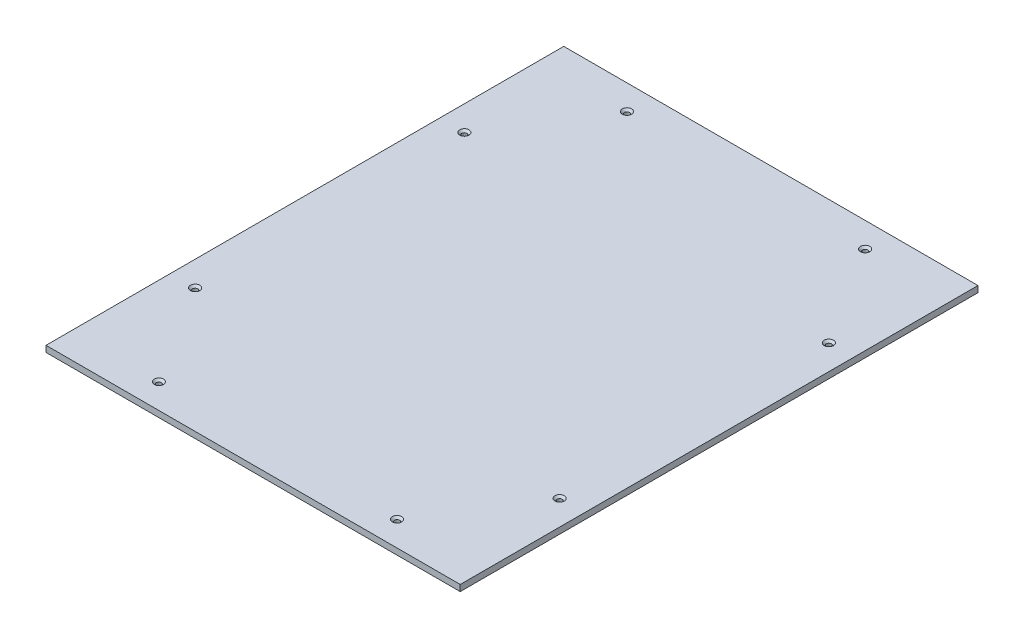
ISO-10303-21;
HEADER;
FILE_DESCRIPTION(('STEP AP214'),'2;1');
FILE_NAME('part.step','',(''),(''),'','','');
FILE_SCHEMA(('AUTOMOTIVE_DESIGN { 1 0 10303 214 1 1 1 1 }'));
ENDSEC;
DATA;
#1=APPLICATION_CONTEXT('core data for automotive mechanical design processes');
#2=APPLICATION_PROTOCOL_DEFINITION('international standard','automotive_design',2000,#1);
#3=PRODUCT_CONTEXT('',#1,'mechanical');
#4=PRODUCT('Part','Part','',(#3));
#5=PRODUCT_RELATED_PRODUCT_CATEGORY('part','',(#4));
#6=PRODUCT_DEFINITION_FORMATION('','',#4);
#7=PRODUCT_DEFINITION_CONTEXT('part definition',#1,'design');
#8=PRODUCT_DEFINITION('design','',#6,#7);
#9=PRODUCT_DEFINITION_SHAPE('','',#8);
#10=(LENGTH_UNIT() NAMED_UNIT(*) SI_UNIT(.MILLI.,.METRE.));
#11=(NAMED_UNIT(*) PLANE_ANGLE_UNIT() SI_UNIT($,.RADIAN.));
#12=(NAMED_UNIT(*) SI_UNIT($,.STERADIAN.) SOLID_ANGLE_UNIT());
#13=UNCERTAINTY_MEASURE_WITH_UNIT(LENGTH_MEASURE(1.E-05),#10,'distance_accuracy_value','');
#14=(GEOMETRIC_REPRESENTATION_CONTEXT(3) GLOBAL_UNCERTAINTY_ASSIGNED_CONTEXT((#13)) GLOBAL_UNIT_ASSIGNED_CONTEXT((#10,
#11,#12)) REPRESENTATION_CONTEXT('',''));
#15=CARTESIAN_POINT('',(0.,0.,0.));
#16=DIRECTION('',(0.,0.,1.));
#17=DIRECTION('',(1.,0.,0.));
#18=AXIS2_PLACEMENT_3D('',#15,#16,#17);
#19=CARTESIAN_POINT('',(200.,6.,250.));
#20=DIRECTION('',(-1.,0.,0.));
#21=DIRECTION('',(0.,0.,1.));
#22=AXIS2_PLACEMENT_3D('',#19,#20,#21);
#23=PLANE('',#22);
#24=DIRECTION('',(0.,0.,-1.));
#25=VECTOR('',#24,1.);
#26=CARTESIAN_POINT('',(200.,0.,250.));
#27=LINE('',#26,#25);
#28=CARTESIAN_POINT('',(200.,0.,250.));
#29=VERTEX_POINT('',#28);
#30=CARTESIAN_POINT('',(200.,0.,-250.));
#31=VERTEX_POINT('',#30);
#32=EDGE_CURVE('E456',#29,#31,#27,.T.);
#33=ORIENTED_EDGE('',*,*,#32,.T.);
#34=DIRECTION('',(0.,-1.,0.));
#35=VECTOR('',#34,1.);
#36=CARTESIAN_POINT('',(200.,6.,-250.));
#37=LINE('',#36,#35);
#38=CARTESIAN_POINT('',(200.,6.,-250.));
#39=VERTEX_POINT('',#38);
#40=EDGE_CURVE('E444',#39,#31,#37,.T.);
#41=ORIENTED_EDGE('',*,*,#40,.F.);
#42=DIRECTION('',(0.,0.,-1.));
#43=VECTOR('',#42,1.);
#44=CARTESIAN_POINT('',(200.,6.,250.));
#45=LINE('',#44,#43);
#46=CARTESIAN_POINT('',(200.,6.,250.));
#47=VERTEX_POINT('',#46);
#48=EDGE_CURVE('E436',#47,#39,#45,.T.);
#49=ORIENTED_EDGE('',*,*,#48,.F.);
#50=DIRECTION('',(0.,-1.,0.));
#51=VECTOR('',#50,1.);
#52=CARTESIAN_POINT('',(200.,6.,250.));
#53=LINE('',#52,#51);
#54=EDGE_CURVE('E452',#47,#29,#53,.T.);
#55=ORIENTED_EDGE('',*,*,#54,.T.);
#56=EDGE_LOOP('',(#33,#41,#49,#55));
#57=FACE_BOUND('',#56,.T.);
#58=ADVANCED_FACE('F381',(#57),#23,.F.);
#59=CARTESIAN_POINT('',(-200.,6.,-250.));
#60=DIRECTION('',(0.,0.,1.));
#61=DIRECTION('',(1.,0.,0.));
#62=AXIS2_PLACEMENT_3D('',#59,#60,#61);
#63=PLANE('',#62);
#64=DIRECTION('',(-1.,0.,0.));
#65=VECTOR('',#64,1.);
#66=CARTESIAN_POINT('',(-200.,0.,-250.));
#67=LINE('',#66,#65);
#68=CARTESIAN_POINT('',(-200.,0.,-250.));
#69=VERTEX_POINT('',#68);
#70=EDGE_CURVE('E442',#31,#69,#67,.T.);
#71=ORIENTED_EDGE('',*,*,#70,.T.);
#72=DIRECTION('',(0.,-1.,0.));
#73=VECTOR('',#72,1.);
#74=CARTESIAN_POINT('',(-200.,6.,-250.));
#75=LINE('',#74,#73);
#76=CARTESIAN_POINT('',(-200.,6.,-250.));
#77=VERTEX_POINT('',#76);
#78=EDGE_CURVE('E440',#77,#69,#75,.T.);
#79=ORIENTED_EDGE('',*,*,#78,.F.);
#80=DIRECTION('',(-1.,0.,0.));
#81=VECTOR('',#80,1.);
#82=CARTESIAN_POINT('',(-200.,6.,-250.));
#83=LINE('',#82,#81);
#84=EDGE_CURVE('E431',#39,#77,#83,.T.);
#85=ORIENTED_EDGE('',*,*,#84,.F.);
#86=ORIENTED_EDGE('',*,*,#40,.T.);
#87=EDGE_LOOP('',(#71,#79,#85,#86));
#88=FACE_BOUND('',#87,.T.);
#89=ADVANCED_FACE('F441',(#88),#63,.F.);
#90=CARTESIAN_POINT('',(-200.,6.,250.));
#91=DIRECTION('',(1.,0.,0.));
#92=DIRECTION('',(0.,0.,-1.));
#93=AXIS2_PLACEMENT_3D('',#90,#91,#92);
#94=PLANE('',#93);
#95=DIRECTION('',(0.,0.,1.));
#96=VECTOR('',#95,1.);
#97=CARTESIAN_POINT('',(-200.,0.,250.));
#98=LINE('',#97,#96);
#99=CARTESIAN_POINT('',(-200.,0.,250.));
#100=VERTEX_POINT('',#99);
#101=EDGE_CURVE('E417',#69,#100,#98,.T.);
#102=ORIENTED_EDGE('',*,*,#101,.T.);
#103=DIRECTION('',(0.,-1.,0.));
#104=VECTOR('',#103,1.);
#105=CARTESIAN_POINT('',(-200.,6.,250.));
#106=LINE('',#105,#104);
#107=CARTESIAN_POINT('',(-200.,6.,250.));
#108=VERTEX_POINT('',#107);
#109=EDGE_CURVE('E445',#108,#100,#106,.T.);
#110=ORIENTED_EDGE('',*,*,#109,.F.);
#111=DIRECTION('',(0.,0.,1.));
#112=VECTOR('',#111,1.);
#113=CARTESIAN_POINT('',(-200.,6.,250.));
#114=LINE('',#113,#112);
#115=EDGE_CURVE('E434',#77,#108,#114,.T.);
#116=ORIENTED_EDGE('',*,*,#115,.F.);
#117=ORIENTED_EDGE('',*,*,#78,.T.);
#118=EDGE_LOOP('',(#102,#110,#116,#117));
#119=FACE_BOUND('',#118,.T.);
#120=ADVANCED_FACE('F447',(#119),#94,.F.);
#121=CARTESIAN_POINT('',(-200.,6.,250.));
#122=DIRECTION('',(0.,0.,-1.));
#123=DIRECTION('',(-1.,0.,0.));
#124=AXIS2_PLACEMENT_3D('',#121,#122,#123);
#125=PLANE('',#124);
#126=DIRECTION('',(1.,0.,0.));
#127=VECTOR('',#126,1.);
#128=CARTESIAN_POINT('',(-200.,0.,250.));
#129=LINE('',#128,#127);
#130=EDGE_CURVE('E423',#100,#29,#129,.T.);
#131=ORIENTED_EDGE('',*,*,#130,.T.);
#132=ORIENTED_EDGE('',*,*,#54,.F.);
#133=DIRECTION('',(1.,0.,0.));
#134=VECTOR('',#133,1.);
#135=CARTESIAN_POINT('',(-200.,6.,250.));
#136=LINE('',#135,#134);
#137=EDGE_CURVE('E400',#108,#47,#136,.T.);
#138=ORIENTED_EDGE('',*,*,#137,.F.);
#139=ORIENTED_EDGE('',*,*,#109,.T.);
#140=EDGE_LOOP('',(#131,#132,#138,#139));
#141=FACE_BOUND('',#140,.T.);
#142=ADVANCED_FACE('F669',(#141),#125,.F.);
#143=CARTESIAN_POINT('',(0.,6.,0.));
#144=DIRECTION('',(0.,-1.,0.));
#145=DIRECTION('',(0.,0.,-1.));
#146=AXIS2_PLACEMENT_3D('',#143,#144,#145);
#147=PLANE('',#146);
#148=CARTESIAN_POINT('',(-176.,6.,-130.));
#149=DIRECTION('',(0.,-1.,0.));
#150=DIRECTION('',(0.,0.,-1.));
#151=AXIS2_PLACEMENT_3D('',#148,#149,#150);
#152=CIRCLE('',#151,4.49999999999995);
#153=CARTESIAN_POINT('',(-176.,6.,-134.5));
#154=VERTEX_POINT('',#153);
#155=EDGE_CURVE('E505',#154,#154,#152,.T.);
#156=ORIENTED_EDGE('',*,*,#155,.T.);
#157=EDGE_LOOP('',(#156));
#158=FACE_BOUND('',#157,.T.);
#159=CARTESIAN_POINT('',(-115.,6.,-226.));
#160=DIRECTION('',(0.,-1.,0.));
#161=DIRECTION('',(0.,0.,-1.));
#162=AXIS2_PLACEMENT_3D('',#159,#160,#161);
#163=CIRCLE('',#162,4.49999999999995);
#164=CARTESIAN_POINT('',(-115.,6.,-230.5));
#165=VERTEX_POINT('',#164);
#166=EDGE_CURVE('E501',#165,#165,#163,.T.);
#167=ORIENTED_EDGE('',*,*,#166,.T.);
#168=EDGE_LOOP('',(#167));
#169=FACE_BOUND('',#168,.T.);
#170=CARTESIAN_POINT('',(115.,6.,-226.));
#171=DIRECTION('',(0.,-1.,0.));
#172=DIRECTION('',(0.,0.,-1.));
#173=AXIS2_PLACEMENT_3D('',#170,#171,#172);
#174=CIRCLE('',#173,4.49999999999995);
#175=CARTESIAN_POINT('',(115.,6.,-230.5));
#176=VERTEX_POINT('',#175);
#177=EDGE_CURVE('E497',#176,#176,#174,.T.);
#178=ORIENTED_EDGE('',*,*,#177,.T.);
#179=EDGE_LOOP('',(#178));
#180=FACE_BOUND('',#179,.T.);
#181=CARTESIAN_POINT('',(176.,6.,-130.));
#182=DIRECTION('',(0.,-1.,0.));
#183=DIRECTION('',(0.,0.,-1.));
#184=AXIS2_PLACEMENT_3D('',#181,#182,#183);
#185=CIRCLE('',#184,4.49999999999995);
#186=CARTESIAN_POINT('',(176.,6.,-134.5));
#187=VERTEX_POINT('',#186);
#188=EDGE_CURVE('E493',#187,#187,#185,.T.);
#189=ORIENTED_EDGE('',*,*,#188,.T.);
#190=EDGE_LOOP('',(#189));
#191=FACE_BOUND('',#190,.T.);
#192=CARTESIAN_POINT('',(176.,6.,130.));
#193=DIRECTION('',(0.,-1.,0.));
#194=DIRECTION('',(0.,0.,-1.));
#195=AXIS2_PLACEMENT_3D('',#192,#193,#194);
#196=CIRCLE('',#195,4.49999999999995);
#197=CARTESIAN_POINT('',(176.,6.,125.5));
#198=VERTEX_POINT('',#197);
#199=EDGE_CURVE('E489',#198,#198,#196,.T.);
#200=ORIENTED_EDGE('',*,*,#199,.T.);
#201=EDGE_LOOP('',(#200));
#202=FACE_BOUND('',#201,.T.);
#203=CARTESIAN_POINT('',(115.,6.,226.));
#204=DIRECTION('',(0.,-1.,0.));
#205=DIRECTION('',(0.,0.,-1.));
#206=AXIS2_PLACEMENT_3D('',#203,#204,#205);
#207=CIRCLE('',#206,4.49999999999995);
#208=CARTESIAN_POINT('',(115.,6.,221.5));
#209=VERTEX_POINT('',#208);
#210=EDGE_CURVE('E485',#209,#209,#207,.T.);
#211=ORIENTED_EDGE('',*,*,#210,.T.);
#212=EDGE_LOOP('',(#211));
#213=FACE_BOUND('',#212,.T.);
#214=CARTESIAN_POINT('',(-115.,6.,226.));
#215=DIRECTION('',(0.,-1.,0.));
#216=DIRECTION('',(0.,0.,-1.));
#217=AXIS2_PLACEMENT_3D('',#214,#215,#216);
#218=CIRCLE('',#217,4.49999999999995);
#219=CARTESIAN_POINT('',(-115.,6.,221.5));
#220=VERTEX_POINT('',#219);
#221=EDGE_CURVE('E481',#220,#220,#218,.T.);
#222=ORIENTED_EDGE('',*,*,#221,.T.);
#223=EDGE_LOOP('',(#222));
#224=FACE_BOUND('',#223,.T.);
#225=CARTESIAN_POINT('',(-176.,6.,130.));
#226=DIRECTION('',(0.,-1.,0.));
#227=DIRECTION('',(0.,0.,-1.));
#228=AXIS2_PLACEMENT_3D('',#225,#226,#227);
#229=CIRCLE('',#228,4.49999999999995);
#230=CARTESIAN_POINT('',(-176.,6.,125.5));
#231=VERTEX_POINT('',#230);
#232=EDGE_CURVE('E477',#231,#231,#229,.T.);
#233=ORIENTED_EDGE('',*,*,#232,.T.);
#234=EDGE_LOOP('',(#233));
#235=FACE_BOUND('',#234,.T.);
#236=ORIENTED_EDGE('',*,*,#48,.T.);
#237=ORIENTED_EDGE('',*,*,#84,.T.);
#238=ORIENTED_EDGE('',*,*,#115,.T.);
#239=ORIENTED_EDGE('',*,*,#137,.T.);
#240=EDGE_LOOP('',(#236,#237,#238,#239));
#241=FACE_BOUND('',#240,.T.);
#242=ADVANCED_FACE('F432',(#158,#169,#180,#191,#202,#213,#224,#235,#241),#147,.F.);
#243=CARTESIAN_POINT('',(0.,0.,0.));
#244=DIRECTION('',(0.,-1.,0.));
#245=DIRECTION('',(0.,0.,-1.));
#246=AXIS2_PLACEMENT_3D('',#243,#244,#245);
#247=PLANE('',#246);
#248=CARTESIAN_POINT('',(-115.,0.,-226.));
#249=DIRECTION('',(0.,1.,0.));
#250=DIRECTION('',(0.,0.,1.));
#251=AXIS2_PLACEMENT_3D('',#248,#249,#250);
#252=CIRCLE('',#251,2.50000000000001);
#253=CARTESIAN_POINT('',(-115.,0.,-223.5));
#254=VERTEX_POINT('',#253);
#255=EDGE_CURVE('E617',#254,#254,#252,.T.);
#256=ORIENTED_EDGE('',*,*,#255,.T.);
#257=EDGE_LOOP('',(#256));
#258=FACE_BOUND('',#257,.T.);
#259=CARTESIAN_POINT('',(176.,0.,130.));
#260=DIRECTION('',(0.,1.,0.));
#261=DIRECTION('',(0.,0.,1.));
#262=AXIS2_PLACEMENT_3D('',#259,#260,#261);
#263=CIRCLE('',#262,2.5);
#264=CARTESIAN_POINT('',(176.,0.,132.5));
#265=VERTEX_POINT('',#264);
#266=EDGE_CURVE('E613',#265,#265,#263,.T.);
#267=ORIENTED_EDGE('',*,*,#266,.T.);
#268=EDGE_LOOP('',(#267));
#269=FACE_BOUND('',#268,.T.);
#270=CARTESIAN_POINT('',(-176.,0.,130.));
#271=DIRECTION('',(0.,1.,0.));
#272=DIRECTION('',(0.,0.,1.));
#273=AXIS2_PLACEMENT_3D('',#270,#271,#272);
#274=CIRCLE('',#273,2.5);
#275=CARTESIAN_POINT('',(-176.,0.,132.5));
#276=VERTEX_POINT('',#275);
#277=EDGE_CURVE('E616',#276,#276,#274,.T.);
#278=ORIENTED_EDGE('',*,*,#277,.T.);
#279=EDGE_LOOP('',(#278));
#280=FACE_BOUND('',#279,.T.);
#281=CARTESIAN_POINT('',(176.,0.,-130.));
#282=DIRECTION('',(0.,1.,0.));
#283=DIRECTION('',(0.,0.,1.));
#284=AXIS2_PLACEMENT_3D('',#281,#282,#283);
#285=CIRCLE('',#284,2.5);
#286=CARTESIAN_POINT('',(176.,0.,-127.5));
#287=VERTEX_POINT('',#286);
#288=EDGE_CURVE('E623',#287,#287,#285,.T.);
#289=ORIENTED_EDGE('',*,*,#288,.T.);
#290=EDGE_LOOP('',(#289));
#291=FACE_BOUND('',#290,.T.);
#292=CARTESIAN_POINT('',(115.,0.,226.));
#293=DIRECTION('',(0.,1.,0.));
#294=DIRECTION('',(0.,0.,1.));
#295=AXIS2_PLACEMENT_3D('',#292,#293,#294);
#296=CIRCLE('',#295,2.50000000000001);
#297=CARTESIAN_POINT('',(115.,0.,228.5));
#298=VERTEX_POINT('',#297);
#299=EDGE_CURVE('E812',#298,#298,#296,.T.);
#300=ORIENTED_EDGE('',*,*,#299,.T.);
#301=EDGE_LOOP('',(#300));
#302=FACE_BOUND('',#301,.T.);
#303=CARTESIAN_POINT('',(-115.,0.,226.));
#304=DIRECTION('',(0.,1.,0.));
#305=DIRECTION('',(0.,0.,1.));
#306=AXIS2_PLACEMENT_3D('',#303,#304,#305);
#307=CIRCLE('',#306,2.50000000000001);
#308=CARTESIAN_POINT('',(-115.,0.,228.5));
#309=VERTEX_POINT('',#308);
#310=EDGE_CURVE('E629',#309,#309,#307,.T.);
#311=ORIENTED_EDGE('',*,*,#310,.T.);
#312=EDGE_LOOP('',(#311));
#313=FACE_BOUND('',#312,.T.);
#314=CARTESIAN_POINT('',(115.,0.,-226.));
#315=DIRECTION('',(0.,1.,0.));
#316=DIRECTION('',(0.,0.,1.));
#317=AXIS2_PLACEMENT_3D('',#314,#315,#316);
#318=CIRCLE('',#317,2.50000000000001);
#319=CARTESIAN_POINT('',(115.,0.,-223.5));
#320=VERTEX_POINT('',#319);
#321=EDGE_CURVE('E626',#320,#320,#318,.T.);
#322=ORIENTED_EDGE('',*,*,#321,.T.);
#323=EDGE_LOOP('',(#322));
#324=FACE_BOUND('',#323,.T.);
#325=CARTESIAN_POINT('',(-176.,0.,-130.));
#326=DIRECTION('',(0.,1.,0.));
#327=DIRECTION('',(0.,0.,1.));
#328=AXIS2_PLACEMENT_3D('',#325,#326,#327);
#329=CIRCLE('',#328,2.5);
#330=CARTESIAN_POINT('',(-176.,0.,-127.5));
#331=VERTEX_POINT('',#330);
#332=EDGE_CURVE('E460',#331,#331,#329,.T.);
#333=ORIENTED_EDGE('',*,*,#332,.T.);
#334=EDGE_LOOP('',(#333));
#335=FACE_BOUND('',#334,.T.);
#336=ORIENTED_EDGE('',*,*,#32,.F.);
#337=ORIENTED_EDGE('',*,*,#130,.F.);
#338=ORIENTED_EDGE('',*,*,#101,.F.);
#339=ORIENTED_EDGE('',*,*,#70,.F.);
#340=EDGE_LOOP('',(#336,#337,#338,#339));
#341=FACE_BOUND('',#340,.T.);
#342=ADVANCED_FACE('F649',(#258,#269,#280,#291,#302,#313,#324,#335,#341),#247,.T.);
#343=CARTESIAN_POINT('',(-176.,0.,-130.));
#344=DIRECTION('',(0.,1.,0.));
#345=DIRECTION('',(0.,0.,1.));
#346=AXIS2_PLACEMENT_3D('',#343,#344,#345);
#347=CYLINDRICAL_SURFACE('',#346,2.5);
#348=CARTESIAN_POINT('',(-176.,4.00000000000003,-130.));
#349=DIRECTION('',(0.,-1.,0.));
#350=DIRECTION('',(0.,0.,-1.));
#351=AXIS2_PLACEMENT_3D('',#348,#349,#350);
#352=CIRCLE('',#351,2.5);
#353=CARTESIAN_POINT('',(-176.,4.00000000000003,-132.5));
#354=VERTEX_POINT('',#353);
#355=EDGE_CURVE('E473',#354,#354,#352,.F.);
#356=ORIENTED_EDGE('',*,*,#355,.T.);
#357=EDGE_LOOP('',(#356));
#358=FACE_BOUND('',#357,.T.);
#359=ORIENTED_EDGE('',*,*,#332,.F.);
#360=EDGE_LOOP('',(#359));
#361=FACE_BOUND('',#360,.T.);
#362=ADVANCED_FACE('F652',(#358,#361),#347,.F.);
#363=CARTESIAN_POINT('',(115.,0.,-226.));
#364=DIRECTION('',(0.,1.,0.));
#365=DIRECTION('',(0.,0.,1.));
#366=AXIS2_PLACEMENT_3D('',#363,#364,#365);
#367=CYLINDRICAL_SURFACE('',#366,2.50000000000001);
#368=CARTESIAN_POINT('',(115.,4.00000000000005,-226.));
#369=DIRECTION('',(0.,-1.,0.));
#370=DIRECTION('',(0.,0.,-1.));
#371=AXIS2_PLACEMENT_3D('',#368,#369,#370);
#372=CIRCLE('',#371,2.50000000000001);
#373=CARTESIAN_POINT('',(115.,4.00000000000005,-228.5));
#374=VERTEX_POINT('',#373);
#375=EDGE_CURVE('E513',#374,#374,#372,.F.);
#376=ORIENTED_EDGE('',*,*,#375,.T.);
#377=EDGE_LOOP('',(#376));
#378=FACE_BOUND('',#377,.T.);
#379=ORIENTED_EDGE('',*,*,#321,.F.);
#380=EDGE_LOOP('',(#379));
#381=FACE_BOUND('',#380,.T.);
#382=ADVANCED_FACE('F654',(#378,#381),#367,.F.);
#383=CARTESIAN_POINT('',(-115.,0.,226.));
#384=DIRECTION('',(0.,1.,0.));
#385=DIRECTION('',(0.,0.,1.));
#386=AXIS2_PLACEMENT_3D('',#383,#384,#385);
#387=CYLINDRICAL_SURFACE('',#386,2.50000000000001);
#388=CARTESIAN_POINT('',(-115.,4.00000000000005,226.));
#389=DIRECTION('',(0.,-1.,0.));
#390=DIRECTION('',(0.,0.,-1.));
#391=AXIS2_PLACEMENT_3D('',#388,#389,#390);
#392=CIRCLE('',#391,2.50000000000001);
#393=CARTESIAN_POINT('',(-115.,4.00000000000005,223.5));
#394=VERTEX_POINT('',#393);
#395=EDGE_CURVE('E392',#394,#394,#392,.F.);
#396=ORIENTED_EDGE('',*,*,#395,.T.);
#397=EDGE_LOOP('',(#396));
#398=FACE_BOUND('',#397,.T.);
#399=ORIENTED_EDGE('',*,*,#310,.F.);
#400=EDGE_LOOP('',(#399));
#401=FACE_BOUND('',#400,.T.);
#402=ADVANCED_FACE('F533',(#398,#401),#387,.F.);
#403=CARTESIAN_POINT('',(115.,0.,226.));
#404=DIRECTION('',(0.,1.,0.));
#405=DIRECTION('',(0.,0.,1.));
#406=AXIS2_PLACEMENT_3D('',#403,#404,#405);
#407=CYLINDRICAL_SURFACE('',#406,2.50000000000001);
#408=CARTESIAN_POINT('',(115.,4.00000000000005,226.));
#409=DIRECTION('',(0.,-1.,0.));
#410=DIRECTION('',(0.,0.,-1.));
#411=AXIS2_PLACEMENT_3D('',#408,#409,#410);
#412=CIRCLE('',#411,2.50000000000001);
#413=CARTESIAN_POINT('',(115.,4.00000000000005,223.5));
#414=VERTEX_POINT('',#413);
#415=EDGE_CURVE('E525',#414,#414,#412,.F.);
#416=ORIENTED_EDGE('',*,*,#415,.T.);
#417=EDGE_LOOP('',(#416));
#418=FACE_BOUND('',#417,.T.);
#419=ORIENTED_EDGE('',*,*,#299,.F.);
#420=EDGE_LOOP('',(#419));
#421=FACE_BOUND('',#420,.T.);
#422=ADVANCED_FACE('F713',(#418,#421),#407,.F.);
#423=CARTESIAN_POINT('',(176.,0.,-130.));
#424=DIRECTION('',(0.,1.,0.));
#425=DIRECTION('',(0.,0.,1.));
#426=AXIS2_PLACEMENT_3D('',#423,#424,#425);
#427=CYLINDRICAL_SURFACE('',#426,2.5);
#428=CARTESIAN_POINT('',(176.,4.00000000000003,-130.));
#429=DIRECTION('',(0.,-1.,0.));
#430=DIRECTION('',(0.,0.,-1.));
#431=AXIS2_PLACEMENT_3D('',#428,#429,#430);
#432=CIRCLE('',#431,2.5);
#433=CARTESIAN_POINT('',(176.,4.00000000000003,-132.5));
#434=VERTEX_POINT('',#433);
#435=EDGE_CURVE('E517',#434,#434,#432,.F.);
#436=ORIENTED_EDGE('',*,*,#435,.T.);
#437=EDGE_LOOP('',(#436));
#438=FACE_BOUND('',#437,.T.);
#439=ORIENTED_EDGE('',*,*,#288,.F.);
#440=EDGE_LOOP('',(#439));
#441=FACE_BOUND('',#440,.T.);
#442=ADVANCED_FACE('F722',(#438,#441),#427,.F.);
#443=CARTESIAN_POINT('',(-176.,0.,130.));
#444=DIRECTION('',(0.,1.,0.));
#445=DIRECTION('',(0.,0.,1.));
#446=AXIS2_PLACEMENT_3D('',#443,#444,#445);
#447=CYLINDRICAL_SURFACE('',#446,2.5);
#448=CARTESIAN_POINT('',(-176.,4.00000000000003,130.));
#449=DIRECTION('',(0.,-1.,0.));
#450=DIRECTION('',(0.,0.,-1.));
#451=AXIS2_PLACEMENT_3D('',#448,#449,#450);
#452=CIRCLE('',#451,2.5);
#453=CARTESIAN_POINT('',(-176.,4.00000000000003,127.5));
#454=VERTEX_POINT('',#453);
#455=EDGE_CURVE('E12',#454,#454,#452,.F.);
#456=ORIENTED_EDGE('',*,*,#455,.T.);
#457=EDGE_LOOP('',(#456));
#458=FACE_BOUND('',#457,.T.);
#459=ORIENTED_EDGE('',*,*,#277,.F.);
#460=EDGE_LOOP('',(#459));
#461=FACE_BOUND('',#460,.T.);
#462=ADVANCED_FACE('F609',(#458,#461),#447,.F.);
#463=CARTESIAN_POINT('',(176.,0.,130.));
#464=DIRECTION('',(0.,1.,0.));
#465=DIRECTION('',(0.,0.,1.));
#466=AXIS2_PLACEMENT_3D('',#463,#464,#465);
#467=CYLINDRICAL_SURFACE('',#466,2.5);
#468=CARTESIAN_POINT('',(176.,4.00000000000003,130.));
#469=DIRECTION('',(0.,-1.,0.));
#470=DIRECTION('',(0.,0.,-1.));
#471=AXIS2_PLACEMENT_3D('',#468,#469,#470);
#472=CIRCLE('',#471,2.5);
#473=CARTESIAN_POINT('',(176.,4.00000000000003,127.5));
#474=VERTEX_POINT('',#473);
#475=EDGE_CURVE('E521',#474,#474,#472,.F.);
#476=ORIENTED_EDGE('',*,*,#475,.T.);
#477=EDGE_LOOP('',(#476));
#478=FACE_BOUND('',#477,.T.);
#479=ORIENTED_EDGE('',*,*,#266,.F.);
#480=EDGE_LOOP('',(#479));
#481=FACE_BOUND('',#480,.T.);
#482=ADVANCED_FACE('F606',(#478,#481),#467,.F.);
#483=CARTESIAN_POINT('',(-115.,0.,-226.));
#484=DIRECTION('',(0.,1.,0.));
#485=DIRECTION('',(0.,0.,1.));
#486=AXIS2_PLACEMENT_3D('',#483,#484,#485);
#487=CYLINDRICAL_SURFACE('',#486,2.50000000000001);
#488=CARTESIAN_POINT('',(-115.,4.00000000000005,-226.));
#489=DIRECTION('',(0.,-1.,0.));
#490=DIRECTION('',(0.,0.,-1.));
#491=AXIS2_PLACEMENT_3D('',#488,#489,#490);
#492=CIRCLE('',#491,2.50000000000001);
#493=CARTESIAN_POINT('',(-115.,4.00000000000005,-228.5));
#494=VERTEX_POINT('',#493);
#495=EDGE_CURVE('E509',#494,#494,#492,.F.);
#496=ORIENTED_EDGE('',*,*,#495,.T.);
#497=EDGE_LOOP('',(#496));
#498=FACE_BOUND('',#497,.T.);
#499=ORIENTED_EDGE('',*,*,#255,.F.);
#500=EDGE_LOOP('',(#499));
#501=FACE_BOUND('',#500,.T.);
#502=ADVANCED_FACE('F567',(#498,#501),#487,.F.);
#503=CARTESIAN_POINT('',(-176.,4.00000000000003,-130.));
#504=DIRECTION('',(0.,1.,0.));
#505=DIRECTION('',(0.,0.,1.));
#506=AXIS2_PLACEMENT_3D('',#503,#504,#505);
#507=CONICAL_SURFACE('',#506,2.5,0.785398163397446);
#508=ORIENTED_EDGE('',*,*,#155,.F.);
#509=EDGE_LOOP('',(#508));
#510=FACE_BOUND('',#509,.T.);
#511=ORIENTED_EDGE('',*,*,#355,.F.);
#512=EDGE_LOOP('',(#511));
#513=FACE_BOUND('',#512,.T.);
#514=ADVANCED_FACE('F560',(#510,#513),#507,.F.);
#515=CARTESIAN_POINT('',(-115.,4.00000000000005,-226.));
#516=DIRECTION('',(0.,1.,0.));
#517=DIRECTION('',(0.,0.,1.));
#518=AXIS2_PLACEMENT_3D('',#515,#516,#517);
#519=CONICAL_SURFACE('',#518,2.50000000000001,0.785398163397446);
#520=ORIENTED_EDGE('',*,*,#166,.F.);
#521=EDGE_LOOP('',(#520));
#522=FACE_BOUND('',#521,.T.);
#523=ORIENTED_EDGE('',*,*,#495,.F.);
#524=EDGE_LOOP('',(#523));
#525=FACE_BOUND('',#524,.T.);
#526=ADVANCED_FACE('F566',(#522,#525),#519,.F.);
#527=CARTESIAN_POINT('',(115.,4.00000000000005,-226.));
#528=DIRECTION('',(0.,1.,0.));
#529=DIRECTION('',(0.,0.,1.));
#530=AXIS2_PLACEMENT_3D('',#527,#528,#529);
#531=CONICAL_SURFACE('',#530,2.50000000000001,0.785398163397446);
#532=ORIENTED_EDGE('',*,*,#177,.F.);
#533=EDGE_LOOP('',(#532));
#534=FACE_BOUND('',#533,.T.);
#535=ORIENTED_EDGE('',*,*,#375,.F.);
#536=EDGE_LOOP('',(#535));
#537=FACE_BOUND('',#536,.T.);
#538=ADVANCED_FACE('F574',(#534,#537),#531,.F.);
#539=CARTESIAN_POINT('',(176.,4.00000000000003,-130.));
#540=DIRECTION('',(0.,1.,0.));
#541=DIRECTION('',(0.,0.,1.));
#542=AXIS2_PLACEMENT_3D('',#539,#540,#541);
#543=CONICAL_SURFACE('',#542,2.5,0.785398163397446);
#544=ORIENTED_EDGE('',*,*,#188,.F.);
#545=EDGE_LOOP('',(#544));
#546=FACE_BOUND('',#545,.T.);
#547=ORIENTED_EDGE('',*,*,#435,.F.);
#548=EDGE_LOOP('',(#547));
#549=FACE_BOUND('',#548,.T.);
#550=ADVANCED_FACE('F581',(#546,#549),#543,.F.);
#551=CARTESIAN_POINT('',(176.,4.00000000000003,130.));
#552=DIRECTION('',(0.,1.,0.));
#553=DIRECTION('',(0.,0.,1.));
#554=AXIS2_PLACEMENT_3D('',#551,#552,#553);
#555=CONICAL_SURFACE('',#554,2.5,0.785398163397446);
#556=ORIENTED_EDGE('',*,*,#199,.F.);
#557=EDGE_LOOP('',(#556));
#558=FACE_BOUND('',#557,.T.);
#559=ORIENTED_EDGE('',*,*,#475,.F.);
#560=EDGE_LOOP('',(#559));
#561=FACE_BOUND('',#560,.T.);
#562=ADVANCED_FACE('F545',(#558,#561),#555,.F.);
#563=CARTESIAN_POINT('',(115.,4.00000000000005,226.));
#564=DIRECTION('',(0.,1.,0.));
#565=DIRECTION('',(0.,0.,1.));
#566=AXIS2_PLACEMENT_3D('',#563,#564,#565);
#567=CONICAL_SURFACE('',#566,2.50000000000001,0.785398163397446);
#568=ORIENTED_EDGE('',*,*,#210,.F.);
#569=EDGE_LOOP('',(#568));
#570=FACE_BOUND('',#569,.T.);
#571=ORIENTED_EDGE('',*,*,#415,.F.);
#572=EDGE_LOOP('',(#571));
#573=FACE_BOUND('',#572,.T.);
#574=ADVANCED_FACE('F538',(#570,#573),#567,.F.);
#575=CARTESIAN_POINT('',(-115.,4.00000000000005,226.));
#576=DIRECTION('',(0.,1.,0.));
#577=DIRECTION('',(0.,0.,1.));
#578=AXIS2_PLACEMENT_3D('',#575,#576,#577);
#579=CONICAL_SURFACE('',#578,2.50000000000001,0.785398163397446);
#580=ORIENTED_EDGE('',*,*,#221,.F.);
#581=EDGE_LOOP('',(#580));
#582=FACE_BOUND('',#581,.T.);
#583=ORIENTED_EDGE('',*,*,#395,.F.);
#584=EDGE_LOOP('',(#583));
#585=FACE_BOUND('',#584,.T.);
#586=ADVANCED_FACE('F536',(#582,#585),#579,.F.);
#587=CARTESIAN_POINT('',(-176.,4.00000000000003,130.));
#588=DIRECTION('',(0.,1.,0.));
#589=DIRECTION('',(0.,0.,1.));
#590=AXIS2_PLACEMENT_3D('',#587,#588,#589);
#591=CONICAL_SURFACE('',#590,2.5,0.785398163397446);
#592=ORIENTED_EDGE('',*,*,#232,.F.);
#593=EDGE_LOOP('',(#592));
#594=FACE_BOUND('',#593,.T.);
#595=ORIENTED_EDGE('',*,*,#455,.F.);
#596=EDGE_LOOP('',(#595));
#597=FACE_BOUND('',#596,.T.);
#598=ADVANCED_FACE('F384',(#594,#597),#591,.F.);
#599=CLOSED_SHELL('',(#58,#89,#120,#142,#242,#342,#362,#382,#402,#422,#442,#462,#482,#502,#514,
#526,#538,#550,#562,#574,#586,#598));
#600=MANIFOLD_SOLID_BREP('B2',#599);
#601=ADVANCED_BREP_SHAPE_REPRESENTATION('',(#18,#600),#14);
#602=SHAPE_DEFINITION_REPRESENTATION(#9,#601);
ENDSEC;
END-ISO-10303-21;
